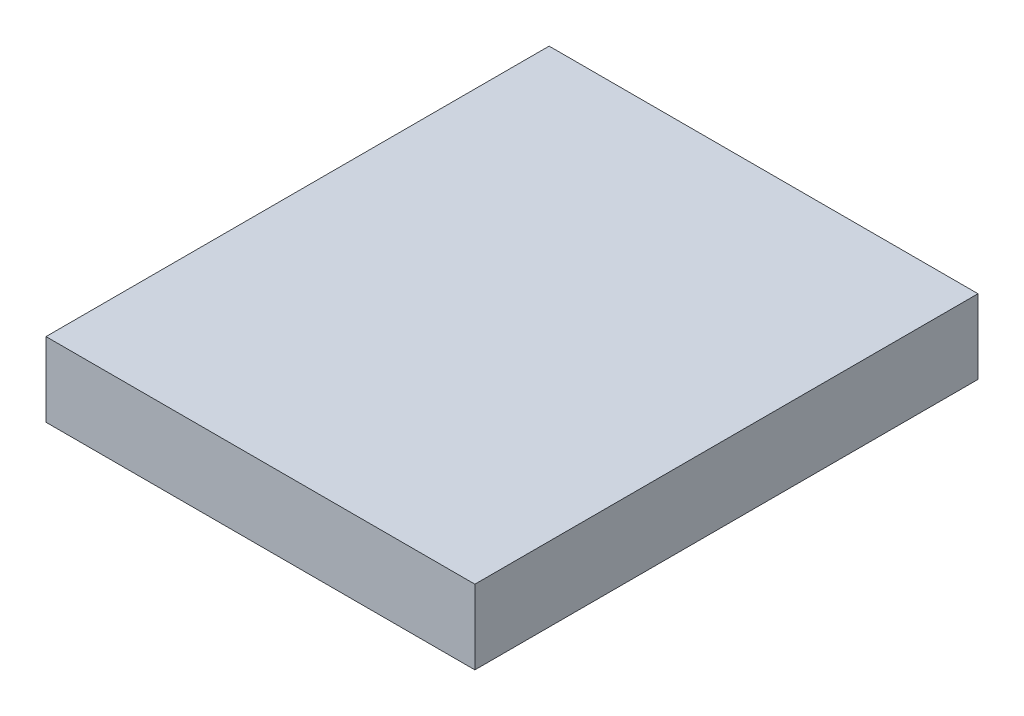
ISO-10303-21;
HEADER;
FILE_DESCRIPTION(('STEP AP214'),'2;1');
FILE_NAME('part.step','',(''),(''),'','','');
FILE_SCHEMA(('AUTOMOTIVE_DESIGN { 1 0 10303 214 1 1 1 1 }'));
ENDSEC;
DATA;
#1=APPLICATION_CONTEXT('core data for automotive mechanical design processes');
#2=APPLICATION_PROTOCOL_DEFINITION('international standard','automotive_design',2000,#1);
#3=PRODUCT_CONTEXT('',#1,'mechanical');
#4=PRODUCT('Part','Part','',(#3));
#5=PRODUCT_RELATED_PRODUCT_CATEGORY('part','',(#4));
#6=PRODUCT_DEFINITION_FORMATION('','',#4);
#7=PRODUCT_DEFINITION_CONTEXT('part definition',#1,'design');
#8=PRODUCT_DEFINITION('design','',#6,#7);
#9=PRODUCT_DEFINITION_SHAPE('','',#8);
#10=(LENGTH_UNIT() NAMED_UNIT(*) SI_UNIT(.MILLI.,.METRE.));
#11=(NAMED_UNIT(*) PLANE_ANGLE_UNIT() SI_UNIT($,.RADIAN.));
#12=(NAMED_UNIT(*) SI_UNIT($,.STERADIAN.) SOLID_ANGLE_UNIT());
#13=UNCERTAINTY_MEASURE_WITH_UNIT(LENGTH_MEASURE(1.E-05),#10,'distance_accuracy_value','');
#14=(GEOMETRIC_REPRESENTATION_CONTEXT(3) GLOBAL_UNCERTAINTY_ASSIGNED_CONTEXT((#13)) GLOBAL_UNIT_ASSIGNED_CONTEXT((#10,
#11,#12)) REPRESENTATION_CONTEXT('',''));
#15=CARTESIAN_POINT('',(0.,0.,0.));
#16=DIRECTION('',(0.,0.,1.));
#17=DIRECTION('',(1.,0.,0.));
#18=AXIS2_PLACEMENT_3D('',#15,#16,#17);
#19=CARTESIAN_POINT('',(-260.,45.,305.));
#20=DIRECTION('',(1.,0.,0.));
#21=DIRECTION('',(0.,0.,-1.));
#22=AXIS2_PLACEMENT_3D('',#19,#20,#21);
#23=PLANE('',#22);
#24=DIRECTION('',(0.,0.,1.));
#25=VECTOR('',#24,1.);
#26=CARTESIAN_POINT('',(-260.,-45.,305.));
#27=LINE('',#26,#25);
#28=CARTESIAN_POINT('',(-260.,-45.,-305.));
#29=VERTEX_POINT('',#28);
#30=CARTESIAN_POINT('',(-260.,-45.,305.));
#31=VERTEX_POINT('',#30);
#32=EDGE_CURVE('E129',#29,#31,#27,.T.);
#33=ORIENTED_EDGE('',*,*,#32,.T.);
#34=DIRECTION('',(0.,-1.,0.));
#35=VECTOR('',#34,1.);
#36=CARTESIAN_POINT('',(-260.,45.,305.));
#37=LINE('',#36,#35);
#38=CARTESIAN_POINT('',(-260.,45.,305.));
#39=VERTEX_POINT('',#38);
#40=EDGE_CURVE('E11',#39,#31,#37,.T.);
#41=ORIENTED_EDGE('',*,*,#40,.F.);
#42=DIRECTION('',(0.,0.,1.));
#43=VECTOR('',#42,1.);
#44=CARTESIAN_POINT('',(-260.,45.,305.));
#45=LINE('',#44,#43);
#46=CARTESIAN_POINT('',(-260.,45.,-305.));
#47=VERTEX_POINT('',#46);
#48=EDGE_CURVE('E149',#47,#39,#45,.T.);
#49=ORIENTED_EDGE('',*,*,#48,.F.);
#50=DIRECTION('',(0.,-1.,0.));
#51=VECTOR('',#50,1.);
#52=CARTESIAN_POINT('',(-260.,45.,-305.));
#53=LINE('',#52,#51);
#54=EDGE_CURVE('E154',#47,#29,#53,.T.);
#55=ORIENTED_EDGE('',*,*,#54,.T.);
#56=EDGE_LOOP('',(#33,#41,#49,#55));
#57=FACE_BOUND('',#56,.T.);
#58=ADVANCED_FACE('F33',(#57),#23,.F.);
#59=CARTESIAN_POINT('',(260.,45.,305.));
#60=DIRECTION('',(0.,0.,-1.));
#61=DIRECTION('',(-1.,0.,0.));
#62=AXIS2_PLACEMENT_3D('',#59,#60,#61);
#63=PLANE('',#62);
#64=DIRECTION('',(1.,0.,0.));
#65=VECTOR('',#64,1.);
#66=CARTESIAN_POINT('',(260.,-45.,305.));
#67=LINE('',#66,#65);
#68=CARTESIAN_POINT('',(260.,-45.,305.));
#69=VERTEX_POINT('',#68);
#70=EDGE_CURVE('E133',#31,#69,#67,.T.);
#71=ORIENTED_EDGE('',*,*,#70,.T.);
#72=DIRECTION('',(0.,-1.,0.));
#73=VECTOR('',#72,1.);
#74=CARTESIAN_POINT('',(260.,45.,305.));
#75=LINE('',#74,#73);
#76=CARTESIAN_POINT('',(260.,45.,305.));
#77=VERTEX_POINT('',#76);
#78=EDGE_CURVE('E40',#77,#69,#75,.T.);
#79=ORIENTED_EDGE('',*,*,#78,.F.);
#80=DIRECTION('',(1.,0.,0.));
#81=VECTOR('',#80,1.);
#82=CARTESIAN_POINT('',(260.,45.,305.));
#83=LINE('',#82,#81);
#84=EDGE_CURVE('E84',#39,#77,#83,.T.);
#85=ORIENTED_EDGE('',*,*,#84,.F.);
#86=ORIENTED_EDGE('',*,*,#40,.T.);
#87=EDGE_LOOP('',(#71,#79,#85,#86));
#88=FACE_BOUND('',#87,.T.);
#89=ADVANCED_FACE('F183',(#88),#63,.F.);
#90=CARTESIAN_POINT('',(260.,45.,305.));
#91=DIRECTION('',(-1.,0.,0.));
#92=DIRECTION('',(0.,0.,1.));
#93=AXIS2_PLACEMENT_3D('',#90,#91,#92);
#94=PLANE('',#93);
#95=DIRECTION('',(0.,0.,-1.));
#96=VECTOR('',#95,1.);
#97=CARTESIAN_POINT('',(260.,-45.,305.));
#98=LINE('',#97,#96);
#99=CARTESIAN_POINT('',(260.,-45.,-305.));
#100=VERTEX_POINT('',#99);
#101=EDGE_CURVE('E157',#69,#100,#98,.T.);
#102=ORIENTED_EDGE('',*,*,#101,.T.);
#103=DIRECTION('',(0.,-1.,0.));
#104=VECTOR('',#103,1.);
#105=CARTESIAN_POINT('',(260.,45.,-305.));
#106=LINE('',#105,#104);
#107=CARTESIAN_POINT('',(260.,45.,-305.));
#108=VERTEX_POINT('',#107);
#109=EDGE_CURVE('E161',#108,#100,#106,.T.);
#110=ORIENTED_EDGE('',*,*,#109,.F.);
#111=DIRECTION('',(0.,0.,-1.));
#112=VECTOR('',#111,1.);
#113=CARTESIAN_POINT('',(260.,45.,305.));
#114=LINE('',#113,#112);
#115=EDGE_CURVE('E152',#77,#108,#114,.T.);
#116=ORIENTED_EDGE('',*,*,#115,.F.);
#117=ORIENTED_EDGE('',*,*,#78,.T.);
#118=EDGE_LOOP('',(#102,#110,#116,#117));
#119=FACE_BOUND('',#118,.T.);
#120=ADVANCED_FACE('F166',(#119),#94,.F.);
#121=CARTESIAN_POINT('',(260.,45.,-305.));
#122=DIRECTION('',(0.,0.,1.));
#123=DIRECTION('',(1.,0.,0.));
#124=AXIS2_PLACEMENT_3D('',#121,#122,#123);
#125=PLANE('',#124);
#126=DIRECTION('',(-1.,0.,0.));
#127=VECTOR('',#126,1.);
#128=CARTESIAN_POINT('',(260.,-45.,-305.));
#129=LINE('',#128,#127);
#130=EDGE_CURVE('E77',#100,#29,#129,.T.);
#131=ORIENTED_EDGE('',*,*,#130,.T.);
#132=ORIENTED_EDGE('',*,*,#54,.F.);
#133=DIRECTION('',(-1.,0.,0.));
#134=VECTOR('',#133,1.);
#135=CARTESIAN_POINT('',(260.,45.,-305.));
#136=LINE('',#135,#134);
#137=EDGE_CURVE('E56',#108,#47,#136,.T.);
#138=ORIENTED_EDGE('',*,*,#137,.F.);
#139=ORIENTED_EDGE('',*,*,#109,.T.);
#140=EDGE_LOOP('',(#131,#132,#138,#139));
#141=FACE_BOUND('',#140,.T.);
#142=ADVANCED_FACE('F174',(#141),#125,.F.);
#143=CARTESIAN_POINT('',(0.,45.,0.));
#144=DIRECTION('',(0.,1.,0.));
#145=DIRECTION('',(0.,0.,1.));
#146=AXIS2_PLACEMENT_3D('',#143,#144,#145);
#147=PLANE('',#146);
#148=ORIENTED_EDGE('',*,*,#48,.T.);
#149=ORIENTED_EDGE('',*,*,#84,.T.);
#150=ORIENTED_EDGE('',*,*,#115,.T.);
#151=ORIENTED_EDGE('',*,*,#137,.T.);
#152=EDGE_LOOP('',(#148,#149,#150,#151));
#153=FACE_BOUND('',#152,.T.);
#154=ADVANCED_FACE('F176',(#153),#147,.T.);
#155=CARTESIAN_POINT('',(0.,-45.,0.));
#156=DIRECTION('',(0.,1.,0.));
#157=DIRECTION('',(0.,0.,1.));
#158=AXIS2_PLACEMENT_3D('',#155,#156,#157);
#159=PLANE('',#158);
#160=DIRECTION('',(-1.,0.,0.));
#161=VECTOR('',#160,1.);
#162=CARTESIAN_POINT('',(260.,-45.,-300.));
#163=LINE('',#162,#161);
#164=CARTESIAN_POINT('',(255.,-45.,-300.));
#165=VERTEX_POINT('',#164);
#166=CARTESIAN_POINT('',(-255.,-45.,-300.));
#167=VERTEX_POINT('',#166);
#168=EDGE_CURVE('E124',#165,#167,#163,.T.);
#169=ORIENTED_EDGE('',*,*,#168,.T.);
#170=DIRECTION('',(0.,0.,1.));
#171=VECTOR('',#170,1.);
#172=CARTESIAN_POINT('',(-255.,-45.,305.));
#173=LINE('',#172,#171);
#174=CARTESIAN_POINT('',(-255.,-45.,300.));
#175=VERTEX_POINT('',#174);
#176=EDGE_CURVE('E143',#167,#175,#173,.T.);
#177=ORIENTED_EDGE('',*,*,#176,.T.);
#178=DIRECTION('',(1.,0.,0.));
#179=VECTOR('',#178,1.);
#180=CARTESIAN_POINT('',(260.,-45.,300.));
#181=LINE('',#180,#179);
#182=CARTESIAN_POINT('',(255.,-45.,300.));
#183=VERTEX_POINT('',#182);
#184=EDGE_CURVE('E128',#175,#183,#181,.T.);
#185=ORIENTED_EDGE('',*,*,#184,.T.);
#186=DIRECTION('',(0.,0.,-1.));
#187=VECTOR('',#186,1.);
#188=CARTESIAN_POINT('',(255.,-45.,305.));
#189=LINE('',#188,#187);
#190=EDGE_CURVE('E47',#183,#165,#189,.T.);
#191=ORIENTED_EDGE('',*,*,#190,.T.);
#192=EDGE_LOOP('',(#169,#177,#185,#191));
#193=FACE_BOUND('',#192,.T.);
#194=ORIENTED_EDGE('',*,*,#32,.F.);
#195=ORIENTED_EDGE('',*,*,#130,.F.);
#196=ORIENTED_EDGE('',*,*,#101,.F.);
#197=ORIENTED_EDGE('',*,*,#70,.F.);
#198=EDGE_LOOP('',(#194,#195,#196,#197));
#199=FACE_BOUND('',#198,.T.);
#200=ADVANCED_FACE('F170',(#193,#199),#159,.F.);
#201=CARTESIAN_POINT('',(-255.,45.,305.));
#202=DIRECTION('',(1.,0.,0.));
#203=DIRECTION('',(0.,0.,-1.));
#204=AXIS2_PLACEMENT_3D('',#201,#202,#203);
#205=PLANE('',#204);
#206=ORIENTED_EDGE('',*,*,#176,.F.);
#207=DIRECTION('',(0.,-1.,0.));
#208=VECTOR('',#207,1.);
#209=CARTESIAN_POINT('',(-255.,45.,-300.));
#210=LINE('',#209,#208);
#211=CARTESIAN_POINT('',(-255.,40.,-300.));
#212=VERTEX_POINT('',#211);
#213=EDGE_CURVE('E123',#212,#167,#210,.T.);
#214=ORIENTED_EDGE('',*,*,#213,.F.);
#215=DIRECTION('',(0.,0.,1.));
#216=VECTOR('',#215,1.);
#217=CARTESIAN_POINT('',(-255.,40.,305.));
#218=LINE('',#217,#216);
#219=CARTESIAN_POINT('',(-255.,40.,300.));
#220=VERTEX_POINT('',#219);
#221=EDGE_CURVE('E111',#212,#220,#218,.T.);
#222=ORIENTED_EDGE('',*,*,#221,.T.);
#223=DIRECTION('',(0.,-1.,0.));
#224=VECTOR('',#223,1.);
#225=CARTESIAN_POINT('',(-255.,45.,300.));
#226=LINE('',#225,#224);
#227=EDGE_CURVE('E121',#220,#175,#226,.T.);
#228=ORIENTED_EDGE('',*,*,#227,.T.);
#229=EDGE_LOOP('',(#206,#214,#222,#228));
#230=FACE_BOUND('',#229,.T.);
#231=ADVANCED_FACE('F120',(#230),#205,.T.);
#232=CARTESIAN_POINT('',(260.,45.,300.));
#233=DIRECTION('',(0.,0.,-1.));
#234=DIRECTION('',(-1.,0.,0.));
#235=AXIS2_PLACEMENT_3D('',#232,#233,#234);
#236=PLANE('',#235);
#237=ORIENTED_EDGE('',*,*,#184,.F.);
#238=ORIENTED_EDGE('',*,*,#227,.F.);
#239=DIRECTION('',(1.,0.,0.));
#240=VECTOR('',#239,1.);
#241=CARTESIAN_POINT('',(260.,40.,300.));
#242=LINE('',#241,#240);
#243=CARTESIAN_POINT('',(255.,40.,300.));
#244=VERTEX_POINT('',#243);
#245=EDGE_CURVE('E107',#220,#244,#242,.T.);
#246=ORIENTED_EDGE('',*,*,#245,.T.);
#247=DIRECTION('',(0.,-1.,0.));
#248=VECTOR('',#247,1.);
#249=CARTESIAN_POINT('',(255.,45.,300.));
#250=LINE('',#249,#248);
#251=EDGE_CURVE('E130',#244,#183,#250,.T.);
#252=ORIENTED_EDGE('',*,*,#251,.T.);
#253=EDGE_LOOP('',(#237,#238,#246,#252));
#254=FACE_BOUND('',#253,.T.);
#255=ADVANCED_FACE('F126',(#254),#236,.T.);
#256=CARTESIAN_POINT('',(255.,45.,305.));
#257=DIRECTION('',(-1.,0.,0.));
#258=DIRECTION('',(0.,0.,1.));
#259=AXIS2_PLACEMENT_3D('',#256,#257,#258);
#260=PLANE('',#259);
#261=ORIENTED_EDGE('',*,*,#190,.F.);
#262=ORIENTED_EDGE('',*,*,#251,.F.);
#263=DIRECTION('',(0.,0.,-1.));
#264=VECTOR('',#263,1.);
#265=CARTESIAN_POINT('',(255.,40.,305.));
#266=LINE('',#265,#264);
#267=CARTESIAN_POINT('',(255.,40.,-300.));
#268=VERTEX_POINT('',#267);
#269=EDGE_CURVE('E112',#244,#268,#266,.T.);
#270=ORIENTED_EDGE('',*,*,#269,.T.);
#271=DIRECTION('',(0.,-1.,0.));
#272=VECTOR('',#271,1.);
#273=CARTESIAN_POINT('',(255.,45.,-300.));
#274=LINE('',#273,#272);
#275=EDGE_CURVE('E135',#268,#165,#274,.T.);
#276=ORIENTED_EDGE('',*,*,#275,.T.);
#277=EDGE_LOOP('',(#261,#262,#270,#276));
#278=FACE_BOUND('',#277,.T.);
#279=ADVANCED_FACE('F231',(#278),#260,.T.);
#280=CARTESIAN_POINT('',(260.,45.,-300.));
#281=DIRECTION('',(0.,0.,1.));
#282=DIRECTION('',(1.,0.,0.));
#283=AXIS2_PLACEMENT_3D('',#280,#281,#282);
#284=PLANE('',#283);
#285=ORIENTED_EDGE('',*,*,#168,.F.);
#286=ORIENTED_EDGE('',*,*,#275,.F.);
#287=DIRECTION('',(-1.,0.,0.));
#288=VECTOR('',#287,1.);
#289=CARTESIAN_POINT('',(260.,40.,-300.));
#290=LINE('',#289,#288);
#291=EDGE_CURVE('E138',#268,#212,#290,.T.);
#292=ORIENTED_EDGE('',*,*,#291,.T.);
#293=ORIENTED_EDGE('',*,*,#213,.T.);
#294=EDGE_LOOP('',(#285,#286,#292,#293));
#295=FACE_BOUND('',#294,.T.);
#296=ADVANCED_FACE('F240',(#295),#284,.T.);
#297=CARTESIAN_POINT('',(0.,40.,0.));
#298=DIRECTION('',(0.,1.,0.));
#299=DIRECTION('',(0.,0.,1.));
#300=AXIS2_PLACEMENT_3D('',#297,#298,#299);
#301=PLANE('',#300);
#302=ORIENTED_EDGE('',*,*,#221,.F.);
#303=ORIENTED_EDGE('',*,*,#291,.F.);
#304=ORIENTED_EDGE('',*,*,#269,.F.);
#305=ORIENTED_EDGE('',*,*,#245,.F.);
#306=EDGE_LOOP('',(#302,#303,#304,#305));
#307=FACE_BOUND('',#306,.T.);
#308=ADVANCED_FACE('F109',(#307),#301,.F.);
#309=CLOSED_SHELL('',(#58,#89,#120,#142,#154,#200,#231,#255,#279,#296,#308));
#310=MANIFOLD_SOLID_BREP('B2',#309);
#311=ADVANCED_BREP_SHAPE_REPRESENTATION('',(#18,#310),#14);
#312=SHAPE_DEFINITION_REPRESENTATION(#9,#311);
ENDSEC;
END-ISO-10303-21;
